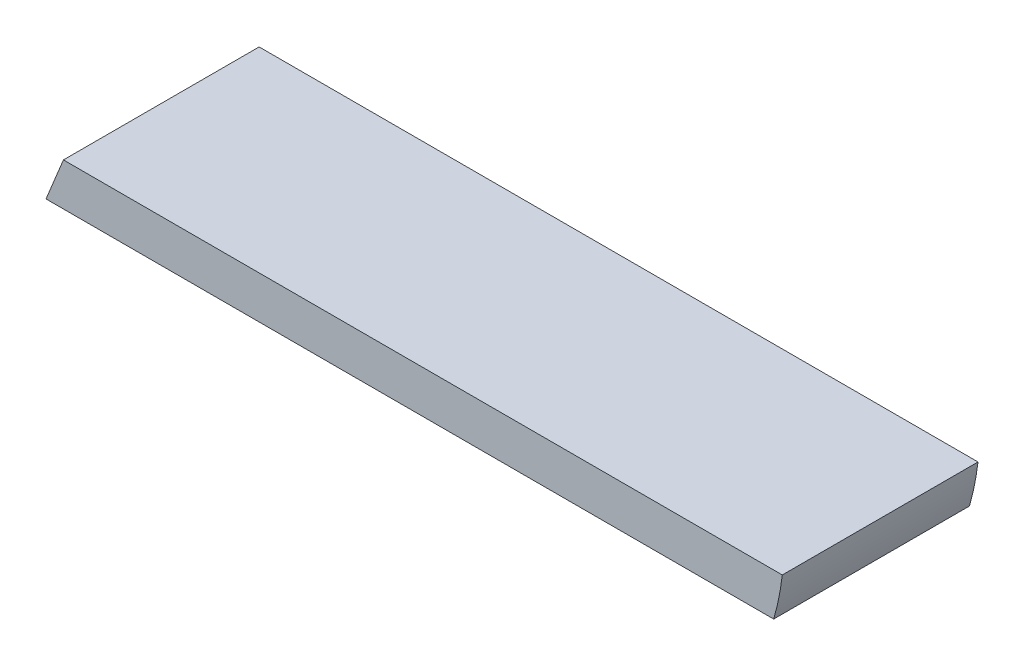
ISO-10303-21;
HEADER;
FILE_DESCRIPTION(('STEP AP214'),'2;1');
FILE_NAME('part.step','',(''),(''),'','','');
FILE_SCHEMA(('AUTOMOTIVE_DESIGN { 1 0 10303 214 1 1 1 1 }'));
ENDSEC;
DATA;
#1=APPLICATION_CONTEXT('core data for automotive mechanical design processes');
#2=APPLICATION_PROTOCOL_DEFINITION('international standard','automotive_design',2000,#1);
#3=PRODUCT_CONTEXT('',#1,'mechanical');
#4=PRODUCT('Part','Part','',(#3));
#5=PRODUCT_RELATED_PRODUCT_CATEGORY('part','',(#4));
#6=PRODUCT_DEFINITION_FORMATION('','',#4);
#7=PRODUCT_DEFINITION_CONTEXT('part definition',#1,'design');
#8=PRODUCT_DEFINITION('design','',#6,#7);
#9=PRODUCT_DEFINITION_SHAPE('','',#8);
#10=(LENGTH_UNIT() NAMED_UNIT(*) SI_UNIT(.MILLI.,.METRE.));
#11=(NAMED_UNIT(*) PLANE_ANGLE_UNIT() SI_UNIT($,.RADIAN.));
#12=(NAMED_UNIT(*) SI_UNIT($,.STERADIAN.) SOLID_ANGLE_UNIT());
#13=UNCERTAINTY_MEASURE_WITH_UNIT(LENGTH_MEASURE(1.E-05),#10,'distance_accuracy_value','');
#14=(GEOMETRIC_REPRESENTATION_CONTEXT(3) GLOBAL_UNCERTAINTY_ASSIGNED_CONTEXT((#13)) GLOBAL_UNIT_ASSIGNED_CONTEXT((#10,
#11,#12)) REPRESENTATION_CONTEXT('',''));
#15=CARTESIAN_POINT('',(0.,0.,0.));
#16=DIRECTION('',(0.,0.,1.));
#17=DIRECTION('',(1.,0.,0.));
#18=AXIS2_PLACEMENT_3D('',#15,#16,#17);
#19=CARTESIAN_POINT('',(-26.717561363392,5.968606226117,0.));
#20=DIRECTION('',(0.,-1.,0.));
#21=DIRECTION('',(1.,0.,0.));
#22=AXIS2_PLACEMENT_3D('',#19,#20,#21);
#23=PLANE('',#22);
#24=DIRECTION('',(-1.,0.,0.));
#25=VECTOR('',#24,1.);
#26=CARTESIAN_POINT('',(-26.345720026126,5.968606226117,0.));
#27=LINE('',#26,#25);
#28=CARTESIAN_POINT('',(-26.345720026126,5.968606226117,0.));
#29=VERTEX_POINT('',#28);
#30=CARTESIAN_POINT('',(-26.717561363392,5.968606226117,0.));
#31=VERTEX_POINT('',#30);
#32=EDGE_CURVE('E11',#29,#31,#27,.T.);
#33=ORIENTED_EDGE('',*,*,#32,.F.);
#34=DIRECTION('',(0.,0.,1.));
#35=VECTOR('',#34,1.);
#36=CARTESIAN_POINT('',(-26.345720026126,5.968606226117,0.));
#37=LINE('',#36,#35);
#38=CARTESIAN_POINT('',(-26.345720026126,5.968606226117,0.1));
#39=VERTEX_POINT('',#38);
#40=EDGE_CURVE('E24',#29,#39,#37,.T.);
#41=ORIENTED_EDGE('',*,*,#40,.T.);
#42=DIRECTION('',(1.,0.,0.));
#43=VECTOR('',#42,1.);
#44=CARTESIAN_POINT('',(-26.345720026126,5.968606226117,0.1));
#45=LINE('',#44,#43);
#46=CARTESIAN_POINT('',(-26.717561363392,5.968606226117,0.1));
#47=VERTEX_POINT('',#46);
#48=EDGE_CURVE('E75',#47,#39,#45,.T.);
#49=ORIENTED_EDGE('',*,*,#48,.F.);
#50=DIRECTION('',(0.,0.,1.));
#51=VECTOR('',#50,1.);
#52=CARTESIAN_POINT('',(-26.717561363392,5.968606226117,0.));
#53=LINE('',#52,#51);
#54=EDGE_CURVE('E85',#31,#47,#53,.T.);
#55=ORIENTED_EDGE('',*,*,#54,.F.);
#56=EDGE_LOOP('',(#33,#41,#49,#55));
#57=FACE_BOUND('',#56,.T.);
#58=ADVANCED_FACE('F17',(#57),#23,.T.);
#59=CARTESIAN_POINT('',(-26.708654096398,5.990335362914,0.));
#60=DIRECTION('',(-0.925276999372955,0.379292070087657,0.));
#61=DIRECTION('',(-0.379292070087657,-0.925276999372955,0.));
#62=AXIS2_PLACEMENT_3D('',#59,#60,#61);
#63=PLANE('',#62);
#64=DIRECTION('',(0.379292070087657,0.925276999372955,0.));
#65=VECTOR('',#64,1.);
#66=CARTESIAN_POINT('',(-26.717561363392,5.968606226117,0.));
#67=LINE('',#66,#65);
#68=CARTESIAN_POINT('',(-26.708654096398,5.990335362914,0.));
#69=VERTEX_POINT('',#68);
#70=EDGE_CURVE('E83',#31,#69,#67,.T.);
#71=ORIENTED_EDGE('',*,*,#70,.F.);
#72=ORIENTED_EDGE('',*,*,#54,.T.);
#73=DIRECTION('',(-0.379292070087657,-0.925276999372955,0.));
#74=VECTOR('',#73,1.);
#75=CARTESIAN_POINT('',(-26.717561363392,5.968606226117,0.1));
#76=LINE('',#75,#74);
#77=CARTESIAN_POINT('',(-26.708654096398,5.990335362914,0.1));
#78=VERTEX_POINT('',#77);
#79=EDGE_CURVE('E81',#78,#47,#76,.T.);
#80=ORIENTED_EDGE('',*,*,#79,.F.);
#81=DIRECTION('',(0.,0.,1.));
#82=VECTOR('',#81,1.);
#83=CARTESIAN_POINT('',(-26.708654096398,5.990335362914,0.));
#84=LINE('',#83,#82);
#85=EDGE_CURVE('E61',#69,#78,#84,.T.);
#86=ORIENTED_EDGE('',*,*,#85,.F.);
#87=EDGE_LOOP('',(#71,#72,#80,#86));
#88=FACE_BOUND('',#87,.T.);
#89=ADVANCED_FACE('F91',(#88),#63,.T.);
#90=CARTESIAN_POINT('',(-26.341326807646,5.990335362914,0.));
#91=DIRECTION('',(0.,1.,0.));
#92=DIRECTION('',(-1.,0.,0.));
#93=AXIS2_PLACEMENT_3D('',#90,#91,#92);
#94=PLANE('',#93);
#95=DIRECTION('',(1.,0.,0.));
#96=VECTOR('',#95,1.);
#97=CARTESIAN_POINT('',(-26.708654096398,5.990335362914,0.));
#98=LINE('',#97,#96);
#99=CARTESIAN_POINT('',(-26.341326807646,5.990335362914,0.));
#100=VERTEX_POINT('',#99);
#101=EDGE_CURVE('E65',#69,#100,#98,.T.);
#102=ORIENTED_EDGE('',*,*,#101,.F.);
#103=ORIENTED_EDGE('',*,*,#85,.T.);
#104=DIRECTION('',(-1.,0.,0.));
#105=VECTOR('',#104,1.);
#106=CARTESIAN_POINT('',(-26.708654096398,5.990335362914,0.1));
#107=LINE('',#106,#105);
#108=CARTESIAN_POINT('',(-26.341326807646,5.990335362914,0.1));
#109=VERTEX_POINT('',#108);
#110=EDGE_CURVE('E54',#109,#78,#107,.T.);
#111=ORIENTED_EDGE('',*,*,#110,.F.);
#112=DIRECTION('',(0.,0.,1.));
#113=VECTOR('',#112,1.);
#114=CARTESIAN_POINT('',(-26.341326807646,5.990335362914,0.));
#115=LINE('',#114,#113);
#116=EDGE_CURVE('E58',#100,#109,#115,.T.);
#117=ORIENTED_EDGE('',*,*,#116,.F.);
#118=EDGE_LOOP('',(#102,#103,#111,#117));
#119=FACE_BOUND('',#118,.T.);
#120=ADVANCED_FACE('F57',(#119),#94,.T.);
#121=CARTESIAN_POINT('',(-26.474240487687,6.005899301844,0.));
#122=DIRECTION('',(0.,0.,1.));
#123=DIRECTION('',(-0.960384866177604,0.278677069054894,0.));
#124=AXIS2_PLACEMENT_3D('',#121,#122,#123);
#125=CYLINDRICAL_SURFACE('',#124,0.133821831316658);
#126=CARTESIAN_POINT('',(-26.474240487687,6.005899301844,0.));
#127=DIRECTION('',(0.,0.,-1.));
#128=DIRECTION('',(-0.960384866177604,0.278677069054894,0.));
#129=AXIS2_PLACEMENT_3D('',#126,#127,#128);
#130=CIRCLE('',#129,0.133821831316658);
#131=EDGE_CURVE('E71',#100,#29,#130,.T.);
#132=ORIENTED_EDGE('',*,*,#131,.F.);
#133=ORIENTED_EDGE('',*,*,#116,.T.);
#134=CARTESIAN_POINT('',(-26.474240487687,6.005899301844,0.1));
#135=DIRECTION('',(0.,0.,1.));
#136=DIRECTION('',(-0.960384866177604,0.278677069054894,0.));
#137=AXIS2_PLACEMENT_3D('',#134,#135,#136);
#138=CIRCLE('',#137,0.133821831316658);
#139=EDGE_CURVE('E70',#39,#109,#138,.T.);
#140=ORIENTED_EDGE('',*,*,#139,.F.);
#141=ORIENTED_EDGE('',*,*,#40,.F.);
#142=EDGE_LOOP('',(#132,#133,#140,#141));
#143=FACE_BOUND('',#142,.T.);
#144=ADVANCED_FACE('F69',(#143),#125,.T.);
#145=CARTESIAN_POINT('',(-26.529949946861,5.979406564498,0.));
#146=DIRECTION('',(0.,0.,1.));
#147=DIRECTION('',(1.,0.,0.));
#148=AXIS2_PLACEMENT_3D('',#145,#146,#147);
#149=PLANE('',#148);
#150=ORIENTED_EDGE('',*,*,#131,.T.);
#151=ORIENTED_EDGE('',*,*,#32,.T.);
#152=ORIENTED_EDGE('',*,*,#70,.T.);
#153=ORIENTED_EDGE('',*,*,#101,.T.);
#154=EDGE_LOOP('',(#150,#151,#152,#153));
#155=FACE_BOUND('',#154,.T.);
#156=ADVANCED_FACE('F88',(#155),#149,.F.);
#157=CARTESIAN_POINT('',(-26.529949946861,5.979406564498,0.1));
#158=DIRECTION('',(0.,0.,1.));
#159=DIRECTION('',(1.,0.,0.));
#160=AXIS2_PLACEMENT_3D('',#157,#158,#159);
#161=PLANE('',#160);
#162=ORIENTED_EDGE('',*,*,#139,.T.);
#163=ORIENTED_EDGE('',*,*,#110,.T.);
#164=ORIENTED_EDGE('',*,*,#79,.T.);
#165=ORIENTED_EDGE('',*,*,#48,.T.);
#166=EDGE_LOOP('',(#162,#163,#164,#165));
#167=FACE_BOUND('',#166,.T.);
#168=ADVANCED_FACE('F74',(#167),#161,.T.);
#169=CLOSED_SHELL('',(#58,#89,#120,#144,#156,#168));
#170=MANIFOLD_SOLID_BREP('B1',#169);
#171=ADVANCED_BREP_SHAPE_REPRESENTATION('',(#18,#170),#14);
#172=SHAPE_DEFINITION_REPRESENTATION(#9,#171);
ENDSEC;
END-ISO-10303-21;
